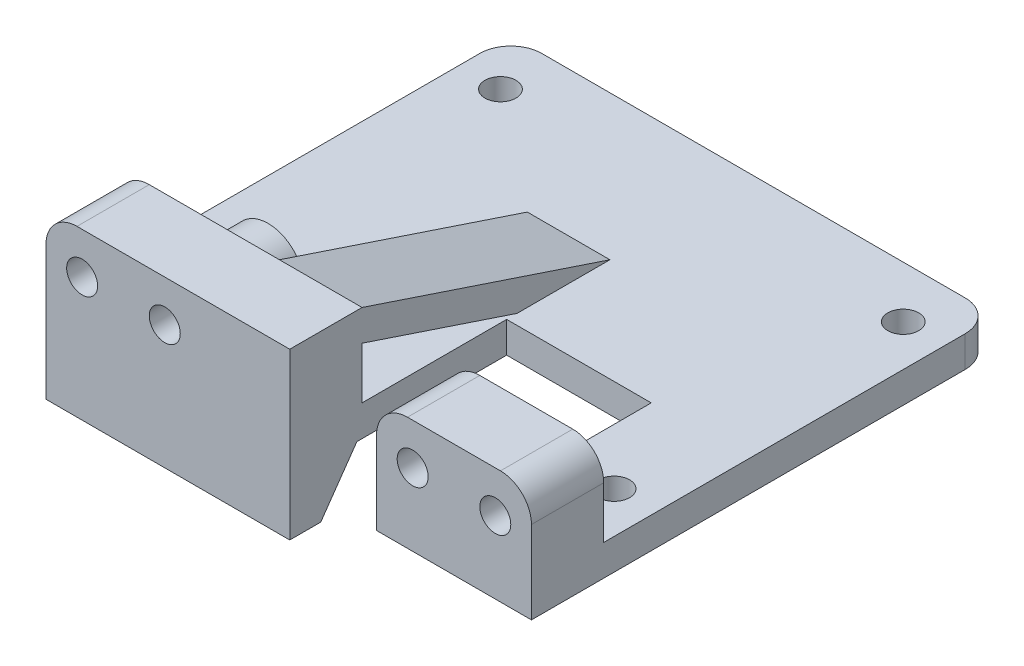
ISO-10303-21;
HEADER;
FILE_DESCRIPTION(('STEP AP214'),'2;1');
FILE_NAME('part.step','',(''),(''),'','','');
FILE_SCHEMA(('AUTOMOTIVE_DESIGN { 1 0 10303 214 1 1 1 1 }'));
ENDSEC;
DATA;
#1=APPLICATION_CONTEXT('core data for automotive mechanical design processes');
#2=APPLICATION_PROTOCOL_DEFINITION('international standard','automotive_design',2000,#1);
#3=PRODUCT_CONTEXT('',#1,'mechanical');
#4=PRODUCT('Part','Part','',(#3));
#5=PRODUCT_RELATED_PRODUCT_CATEGORY('part','',(#4));
#6=PRODUCT_DEFINITION_FORMATION('','',#4);
#7=PRODUCT_DEFINITION_CONTEXT('part definition',#1,'design');
#8=PRODUCT_DEFINITION('design','',#6,#7);
#9=PRODUCT_DEFINITION_SHAPE('','',#8);
#10=(LENGTH_UNIT() NAMED_UNIT(*) SI_UNIT(.MILLI.,.METRE.));
#11=(NAMED_UNIT(*) PLANE_ANGLE_UNIT() SI_UNIT($,.RADIAN.));
#12=(NAMED_UNIT(*) SI_UNIT($,.STERADIAN.) SOLID_ANGLE_UNIT());
#13=UNCERTAINTY_MEASURE_WITH_UNIT(LENGTH_MEASURE(1.E-05),#10,'distance_accuracy_value','');
#14=(GEOMETRIC_REPRESENTATION_CONTEXT(3) GLOBAL_UNCERTAINTY_ASSIGNED_CONTEXT((#13)) GLOBAL_UNIT_ASSIGNED_CONTEXT((#10,
#11,#12)) REPRESENTATION_CONTEXT('',''));
#15=CARTESIAN_POINT('',(0.,0.,0.));
#16=DIRECTION('',(0.,0.,1.));
#17=DIRECTION('',(1.,0.,0.));
#18=AXIS2_PLACEMENT_3D('',#15,#16,#17);
#19=CARTESIAN_POINT('',(0.,0.,19.));
#20=DIRECTION('',(0.,0.,1.));
#21=DIRECTION('',(1.,0.,0.));
#22=AXIS2_PLACEMENT_3D('',#19,#20,#21);
#23=PLANE('',#22);
#24=CARTESIAN_POINT('',(-20.,7.,19.));
#25=DIRECTION('',(0.,0.,1.));
#26=DIRECTION('',(1.,0.,0.));
#27=AXIS2_PLACEMENT_3D('',#24,#25,#26);
#28=CIRCLE('',#27,1.5);
#29=CARTESIAN_POINT('',(-18.5,7.,19.));
#30=VERTEX_POINT('',#29);
#31=EDGE_CURVE('E320',#30,#30,#28,.F.);
#32=ORIENTED_EDGE('',*,*,#31,.F.);
#33=EDGE_LOOP('',(#32));
#34=FACE_BOUND('',#33,.T.);
#35=DIRECTION('',(0.,1.,0.));
#36=VECTOR('',#35,1.);
#37=CARTESIAN_POINT('',(-23.5,0.,19.));
#38=LINE('',#37,#36);
#39=CARTESIAN_POINT('',(-23.5,3.,19.));
#40=VERTEX_POINT('',#39);
#41=CARTESIAN_POINT('',(-23.5,8.00000000000071,19.));
#42=VERTEX_POINT('',#41);
#43=EDGE_CURVE('E316',#40,#42,#38,.T.);
#44=ORIENTED_EDGE('',*,*,#43,.T.);
#45=CARTESIAN_POINT('',(-20.5,8.00000000000071,19.));
#46=DIRECTION('',(0.,0.,1.));
#47=DIRECTION('',(1.,0.,0.));
#48=AXIS2_PLACEMENT_3D('',#45,#46,#47);
#49=CIRCLE('',#48,3.);
#50=CARTESIAN_POINT('',(-20.4999999999999,11.0000000000007,19.));
#51=VERTEX_POINT('',#50);
#52=EDGE_CURVE('E411',#42,#51,#49,.F.);
#53=ORIENTED_EDGE('',*,*,#52,.T.);
#54=DIRECTION('',(-1.,0.,0.));
#55=VECTOR('',#54,1.);
#56=CARTESIAN_POINT('',(3.81639164714916E-13,11.,19.));
#57=LINE('',#56,#55);
#58=CARTESIAN_POINT('',(-7.9,11.,19.));
#59=VERTEX_POINT('',#58);
#60=EDGE_CURVE('E337',#59,#51,#57,.T.);
#61=ORIENTED_EDGE('',*,*,#60,.F.);
#62=DIRECTION('',(0.,-1.,0.));
#63=VECTOR('',#62,1.);
#64=CARTESIAN_POINT('',(-7.9,11.,19.));
#65=LINE('',#64,#63);
#66=CARTESIAN_POINT('',(-7.9,8.,19.));
#67=VERTEX_POINT('',#66);
#68=EDGE_CURVE('E257',#59,#67,#65,.T.);
#69=ORIENTED_EDGE('',*,*,#68,.T.);
#70=DIRECTION('',(1.,0.,0.));
#71=VECTOR('',#70,1.);
#72=CARTESIAN_POINT('',(-7.9,8.,19.));
#73=LINE('',#72,#71);
#74=CARTESIAN_POINT('',(0.0999999999999994,8.,19.));
#75=VERTEX_POINT('',#74);
#76=EDGE_CURVE('E266',#67,#75,#73,.T.);
#77=ORIENTED_EDGE('',*,*,#76,.T.);
#78=DIRECTION('',(0.,1.,0.));
#79=VECTOR('',#78,1.);
#80=CARTESIAN_POINT('',(0.0999999999999994,0.,19.));
#81=LINE('',#80,#79);
#82=CARTESIAN_POINT('',(0.0999999999999994,3.,19.));
#83=VERTEX_POINT('',#82);
#84=EDGE_CURVE('E334',#83,#75,#81,.T.);
#85=ORIENTED_EDGE('',*,*,#84,.F.);
#86=DIRECTION('',(1.,0.,0.));
#87=VECTOR('',#86,1.);
#88=CARTESIAN_POINT('',(0.,3.,19.));
#89=LINE('',#88,#87);
#90=EDGE_CURVE('E363',#40,#83,#89,.T.);
#91=ORIENTED_EDGE('',*,*,#90,.F.);
#92=EDGE_LOOP('',(#44,#53,#61,#69,#77,#85,#91));
#93=FACE_BOUND('',#92,.T.);
#94=CARTESIAN_POINT('',(-12.,7.,19.));
#95=DIRECTION('',(0.,0.,1.));
#96=DIRECTION('',(1.,0.,0.));
#97=AXIS2_PLACEMENT_3D('',#94,#95,#96);
#98=CIRCLE('',#97,3.5);
#99=CARTESIAN_POINT('',(-8.50000000000001,7.,19.));
#100=VERTEX_POINT('',#99);
#101=EDGE_CURVE('E11',#100,#100,#98,.F.);
#102=ORIENTED_EDGE('',*,*,#101,.F.);
#103=EDGE_LOOP('',(#102));
#104=FACE_BOUND('',#103,.T.);
#105=ADVANCED_FACE('F49',(#34,#93,#104),#23,.F.);
#106=CARTESIAN_POINT('',(0.,3.,5.));
#107=DIRECTION('',(0.,0.,-1.));
#108=DIRECTION('',(-1.,0.,0.));
#109=AXIS2_PLACEMENT_3D('',#106,#107,#108);
#110=PLANE('',#109);
#111=DIRECTION('',(1.,0.,0.));
#112=VECTOR('',#111,1.);
#113=CARTESIAN_POINT('',(0.,0.,5.));
#114=LINE('',#113,#112);
#115=CARTESIAN_POINT('',(0.0999999999999994,0.,5.));
#116=VERTEX_POINT('',#115);
#117=CARTESIAN_POINT('',(14.1,0.,5.));
#118=VERTEX_POINT('',#117);
#119=EDGE_CURVE('E384',#116,#118,#114,.T.);
#120=ORIENTED_EDGE('',*,*,#119,.T.);
#121=DIRECTION('',(0.,-1.,0.));
#122=VECTOR('',#121,1.);
#123=CARTESIAN_POINT('',(14.1,3.,5.));
#124=LINE('',#123,#122);
#125=CARTESIAN_POINT('',(14.1,3.,5.));
#126=VERTEX_POINT('',#125);
#127=EDGE_CURVE('E405',#126,#118,#124,.T.);
#128=ORIENTED_EDGE('',*,*,#127,.F.);
#129=DIRECTION('',(1.,0.,0.));
#130=VECTOR('',#129,1.);
#131=CARTESIAN_POINT('',(0.,3.,5.));
#132=LINE('',#131,#130);
#133=CARTESIAN_POINT('',(0.0999999999999994,3.,5.));
#134=VERTEX_POINT('',#133);
#135=EDGE_CURVE('E353',#134,#126,#132,.T.);
#136=ORIENTED_EDGE('',*,*,#135,.F.);
#137=DIRECTION('',(0.,-1.,0.));
#138=VECTOR('',#137,1.);
#139=CARTESIAN_POINT('',(0.0999999999999994,3.,5.));
#140=LINE('',#139,#138);
#141=EDGE_CURVE('E378',#134,#116,#140,.T.);
#142=ORIENTED_EDGE('',*,*,#141,.T.);
#143=EDGE_LOOP('',(#120,#128,#136,#142));
#144=FACE_BOUND('',#143,.T.);
#145=ADVANCED_FACE('F472',(#144),#110,.F.);
#146=CARTESIAN_POINT('',(14.1,3.,0.));
#147=DIRECTION('',(1.,0.,0.));
#148=DIRECTION('',(0.,0.,-1.));
#149=AXIS2_PLACEMENT_3D('',#146,#147,#148);
#150=PLANE('',#149);
#151=DIRECTION('',(0.,0.,1.));
#152=VECTOR('',#151,1.);
#153=CARTESIAN_POINT('',(14.1,0.,0.));
#154=LINE('',#153,#152);
#155=CARTESIAN_POINT('',(14.1,0.,14.));
#156=VERTEX_POINT('',#155);
#157=EDGE_CURVE('E387',#118,#156,#154,.T.);
#158=ORIENTED_EDGE('',*,*,#157,.T.);
#159=DIRECTION('',(0.,-1.,0.));
#160=VECTOR('',#159,1.);
#161=CARTESIAN_POINT('',(14.1,3.,14.));
#162=LINE('',#161,#160);
#163=CARTESIAN_POINT('',(14.1,3.,14.));
#164=VERTEX_POINT('',#163);
#165=EDGE_CURVE('E438',#156,#164,#162,.F.);
#166=ORIENTED_EDGE('',*,*,#165,.T.);
#167=DIRECTION('',(0.,0.,1.));
#168=VECTOR('',#167,1.);
#169=CARTESIAN_POINT('',(14.1,3.,0.));
#170=LINE('',#169,#168);
#171=EDGE_CURVE('E356',#126,#164,#170,.T.);
#172=ORIENTED_EDGE('',*,*,#171,.F.);
#173=ORIENTED_EDGE('',*,*,#127,.T.);
#174=EDGE_LOOP('',(#158,#166,#172,#173));
#175=FACE_BOUND('',#174,.T.);
#176=ADVANCED_FACE('F530',(#175),#150,.F.);
#177=CARTESIAN_POINT('',(23.5,3.,0.));
#178=DIRECTION('',(-1.,0.,0.));
#179=DIRECTION('',(0.,0.,1.));
#180=AXIS2_PLACEMENT_3D('',#177,#178,#179);
#181=PLANE('',#180);
#182=DIRECTION('',(0.,0.,-1.));
#183=VECTOR('',#182,1.);
#184=CARTESIAN_POINT('',(23.5,0.,0.));
#185=LINE('',#184,#183);
#186=CARTESIAN_POINT('',(23.5,0.,26.));
#187=VERTEX_POINT('',#186);
#188=CARTESIAN_POINT('',(23.5,0.,-16.));
#189=VERTEX_POINT('',#188);
#190=EDGE_CURVE('E390',#187,#189,#185,.T.);
#191=ORIENTED_EDGE('',*,*,#190,.T.);
#192=DIRECTION('',(0.,-1.,0.));
#193=VECTOR('',#192,1.);
#194=CARTESIAN_POINT('',(23.5,3.,-16.));
#195=LINE('',#194,#193);
#196=CARTESIAN_POINT('',(23.5,3.,-16.));
#197=VERTEX_POINT('',#196);
#198=EDGE_CURVE('E72',#189,#197,#195,.F.);
#199=ORIENTED_EDGE('',*,*,#198,.T.);
#200=DIRECTION('',(0.,0.,-1.));
#201=VECTOR('',#200,1.);
#202=CARTESIAN_POINT('',(23.5,3.,0.));
#203=LINE('',#202,#201);
#204=CARTESIAN_POINT('',(23.5,3.,19.));
#205=VERTEX_POINT('',#204);
#206=EDGE_CURVE('E362',#205,#197,#203,.T.);
#207=ORIENTED_EDGE('',*,*,#206,.F.);
#208=DIRECTION('',(0.,-1.,0.));
#209=VECTOR('',#208,1.);
#210=CARTESIAN_POINT('',(23.5,0.,19.));
#211=LINE('',#210,#209);
#212=CARTESIAN_POINT('',(23.5,8.,19.));
#213=VERTEX_POINT('',#212);
#214=EDGE_CURVE('E285',#213,#205,#211,.T.);
#215=ORIENTED_EDGE('',*,*,#214,.F.);
#216=DIRECTION('',(0.,0.,-1.));
#217=VECTOR('',#216,1.);
#218=CARTESIAN_POINT('',(23.5,8.,26.));
#219=LINE('',#218,#217);
#220=CARTESIAN_POINT('',(23.5,8.,26.));
#221=VERTEX_POINT('',#220);
#222=EDGE_CURVE('E433',#213,#221,#219,.F.);
#223=ORIENTED_EDGE('',*,*,#222,.T.);
#224=DIRECTION('',(0.,-1.,0.));
#225=VECTOR('',#224,1.);
#226=CARTESIAN_POINT('',(23.5,0.,26.));
#227=LINE('',#226,#225);
#228=EDGE_CURVE('E297',#221,#187,#227,.T.);
#229=ORIENTED_EDGE('',*,*,#228,.T.);
#230=EDGE_LOOP('',(#191,#199,#207,#215,#223,#229));
#231=FACE_BOUND('',#230,.T.);
#232=ADVANCED_FACE('F567',(#231),#181,.F.);
#233=CARTESIAN_POINT('',(0.,3.,-19.));
#234=DIRECTION('',(0.,0.,-1.));
#235=DIRECTION('',(-1.,0.,0.));
#236=AXIS2_PLACEMENT_3D('',#233,#234,#235);
#237=PLANE('',#236);
#238=DIRECTION('',(1.,0.,0.));
#239=VECTOR('',#238,1.);
#240=CARTESIAN_POINT('',(0.,3.,-19.));
#241=LINE('',#240,#239);
#242=CARTESIAN_POINT('',(-20.5,3.,-19.));
#243=VERTEX_POINT('',#242);
#244=CARTESIAN_POINT('',(20.5,3.,-19.));
#245=VERTEX_POINT('',#244);
#246=EDGE_CURVE('E365',#243,#245,#241,.T.);
#247=ORIENTED_EDGE('',*,*,#246,.T.);
#248=DIRECTION('',(0.,-1.,0.));
#249=VECTOR('',#248,1.);
#250=CARTESIAN_POINT('',(20.5,0.,-19.));
#251=LINE('',#250,#249);
#252=CARTESIAN_POINT('',(20.5,0.,-19.));
#253=VERTEX_POINT('',#252);
#254=EDGE_CURVE('E447',#245,#253,#251,.T.);
#255=ORIENTED_EDGE('',*,*,#254,.T.);
#256=DIRECTION('',(1.,0.,0.));
#257=VECTOR('',#256,1.);
#258=CARTESIAN_POINT('',(0.,0.,-19.));
#259=LINE('',#258,#257);
#260=CARTESIAN_POINT('',(-20.5,0.,-19.));
#261=VERTEX_POINT('',#260);
#262=EDGE_CURVE('E392',#261,#253,#259,.T.);
#263=ORIENTED_EDGE('',*,*,#262,.F.);
#264=DIRECTION('',(0.,-1.,0.));
#265=VECTOR('',#264,1.);
#266=CARTESIAN_POINT('',(-20.5,3.,-19.));
#267=LINE('',#266,#265);
#268=EDGE_CURVE('E445',#261,#243,#267,.F.);
#269=ORIENTED_EDGE('',*,*,#268,.T.);
#270=EDGE_LOOP('',(#247,#255,#263,#269));
#271=FACE_BOUND('',#270,.T.);
#272=ADVANCED_FACE('F564',(#271),#237,.T.);
#273=CARTESIAN_POINT('',(-23.5,3.,0.));
#274=DIRECTION('',(-1.,0.,0.));
#275=DIRECTION('',(0.,0.,1.));
#276=AXIS2_PLACEMENT_3D('',#273,#274,#275);
#277=PLANE('',#276);
#278=DIRECTION('',(0.,0.,-1.));
#279=VECTOR('',#278,1.);
#280=CARTESIAN_POINT('',(-23.5,3.,0.));
#281=LINE('',#280,#279);
#282=CARTESIAN_POINT('',(-23.5,3.,-16.));
#283=VERTEX_POINT('',#282);
#284=EDGE_CURVE('E368',#40,#283,#281,.T.);
#285=ORIENTED_EDGE('',*,*,#284,.T.);
#286=DIRECTION('',(0.,-1.,0.));
#287=VECTOR('',#286,1.);
#288=CARTESIAN_POINT('',(-23.5,3.,-16.));
#289=LINE('',#288,#287);
#290=CARTESIAN_POINT('',(-23.5,0.,-16.));
#291=VERTEX_POINT('',#290);
#292=EDGE_CURVE('E57',#283,#291,#289,.T.);
#293=ORIENTED_EDGE('',*,*,#292,.T.);
#294=DIRECTION('',(0.,0.,-1.));
#295=VECTOR('',#294,1.);
#296=CARTESIAN_POINT('',(-23.5,0.,0.));
#297=LINE('',#296,#295);
#298=CARTESIAN_POINT('',(-23.5,0.,19.5));
#299=VERTEX_POINT('',#298);
#300=EDGE_CURVE('E241',#299,#291,#297,.T.);
#301=ORIENTED_EDGE('',*,*,#300,.F.);
#302=DIRECTION('',(0.,-0.81923192051904,0.573462344363328));
#303=VECTOR('',#302,1.);
#304=CARTESIAN_POINT('',(-23.5,-5.,23.));
#305=LINE('',#304,#303);
#306=CARTESIAN_POINT('',(-23.5,-5.,23.));
#307=VERTEX_POINT('',#306);
#308=EDGE_CURVE('E221',#299,#307,#305,.T.);
#309=ORIENTED_EDGE('',*,*,#308,.T.);
#310=DIRECTION('',(0.,0.,1.));
#311=VECTOR('',#310,1.);
#312=CARTESIAN_POINT('',(-23.5,-5.,26.));
#313=LINE('',#312,#311);
#314=CARTESIAN_POINT('',(-23.5,-5.,26.));
#315=VERTEX_POINT('',#314);
#316=EDGE_CURVE('E231',#307,#315,#313,.T.);
#317=ORIENTED_EDGE('',*,*,#316,.T.);
#318=DIRECTION('',(0.,1.,0.));
#319=VECTOR('',#318,1.);
#320=CARTESIAN_POINT('',(-23.5,0.,26.));
#321=LINE('',#320,#319);
#322=CARTESIAN_POINT('',(-23.5,8.00000000000071,26.));
#323=VERTEX_POINT('',#322);
#324=EDGE_CURVE('E317',#315,#323,#321,.T.);
#325=ORIENTED_EDGE('',*,*,#324,.T.);
#326=DIRECTION('',(0.,0.,-1.));
#327=VECTOR('',#326,1.);
#328=CARTESIAN_POINT('',(-23.5,8.00000000000071,19.));
#329=LINE('',#328,#327);
#330=EDGE_CURVE('E408',#323,#42,#329,.T.);
#331=ORIENTED_EDGE('',*,*,#330,.T.);
#332=ORIENTED_EDGE('',*,*,#43,.F.);
#333=EDGE_LOOP('',(#285,#293,#301,#309,#317,#325,#331,#332));
#334=FACE_BOUND('',#333,.T.);
#335=ADVANCED_FACE('F238',(#334),#277,.T.);
#336=CARTESIAN_POINT('',(-19.5,3.,14.));
#337=DIRECTION('',(0.,-1.,0.));
#338=DIRECTION('',(0.,0.,-1.));
#339=AXIS2_PLACEMENT_3D('',#336,#337,#338);
#340=CYLINDRICAL_SURFACE('',#339,1.5);
#341=CARTESIAN_POINT('',(-19.5,3.,14.));
#342=DIRECTION('',(0.,1.,0.));
#343=DIRECTION('',(0.,0.,1.));
#344=AXIS2_PLACEMENT_3D('',#341,#342,#343);
#345=CIRCLE('',#344,1.5);
#346=CARTESIAN_POINT('',(-19.5,3.,15.5));
#347=VERTEX_POINT('',#346);
#348=EDGE_CURVE('E372',#347,#347,#345,.T.);
#349=ORIENTED_EDGE('',*,*,#348,.T.);
#350=EDGE_LOOP('',(#349));
#351=FACE_BOUND('',#350,.T.);
#352=CARTESIAN_POINT('',(-19.5,0.,14.));
#353=DIRECTION('',(0.,1.,0.));
#354=DIRECTION('',(0.,0.,1.));
#355=AXIS2_PLACEMENT_3D('',#352,#353,#354);
#356=CIRCLE('',#355,1.5);
#357=CARTESIAN_POINT('',(-19.5,0.,15.5));
#358=VERTEX_POINT('',#357);
#359=EDGE_CURVE('E398',#358,#358,#356,.T.);
#360=ORIENTED_EDGE('',*,*,#359,.F.);
#361=EDGE_LOOP('',(#360));
#362=FACE_BOUND('',#361,.T.);
#363=ADVANCED_FACE('F555',(#351,#362),#340,.F.);
#364=CARTESIAN_POINT('',(0.0999999999999994,3.,0.));
#365=DIRECTION('',(-1.,0.,0.));
#366=DIRECTION('',(0.,0.,1.));
#367=AXIS2_PLACEMENT_3D('',#364,#365,#366);
#368=PLANE('',#367);
#369=DIRECTION('',(0.,1.,0.));
#370=VECTOR('',#369,1.);
#371=CARTESIAN_POINT('',(0.0999999999999994,0.,26.));
#372=LINE('',#371,#370);
#373=CARTESIAN_POINT('',(0.0999999999999994,-5.,26.));
#374=VERTEX_POINT('',#373);
#375=CARTESIAN_POINT('',(0.0999999999999995,11.,26.));
#376=VERTEX_POINT('',#375);
#377=EDGE_CURVE('E319',#374,#376,#372,.T.);
#378=ORIENTED_EDGE('',*,*,#377,.F.);
#379=DIRECTION('',(0.,0.,-1.));
#380=VECTOR('',#379,1.);
#381=CARTESIAN_POINT('',(0.0999999999999994,-5.,26.));
#382=LINE('',#381,#380);
#383=CARTESIAN_POINT('',(0.0999999999999994,-5.,23.));
#384=VERTEX_POINT('',#383);
#385=EDGE_CURVE('E248',#374,#384,#382,.T.);
#386=ORIENTED_EDGE('',*,*,#385,.T.);
#387=DIRECTION('',(0.,0.81923192051904,-0.573462344363328));
#388=VECTOR('',#387,1.);
#389=CARTESIAN_POINT('',(0.0999999999999994,-5.,23.));
#390=LINE('',#389,#388);
#391=CARTESIAN_POINT('',(0.0999999999999994,0.,19.5));
#392=VERTEX_POINT('',#391);
#393=EDGE_CURVE('E223',#384,#392,#390,.T.);
#394=ORIENTED_EDGE('',*,*,#393,.T.);
#395=DIRECTION('',(0.,0.,-1.));
#396=VECTOR('',#395,1.);
#397=CARTESIAN_POINT('',(0.0999999999999994,0.,0.));
#398=LINE('',#397,#396);
#399=EDGE_CURVE('E396',#392,#116,#398,.T.);
#400=ORIENTED_EDGE('',*,*,#399,.T.);
#401=ORIENTED_EDGE('',*,*,#141,.F.);
#402=DIRECTION('',(0.,0.,-1.));
#403=VECTOR('',#402,1.);
#404=CARTESIAN_POINT('',(0.0999999999999994,3.,0.));
#405=LINE('',#404,#403);
#406=EDGE_CURVE('E370',#83,#134,#405,.T.);
#407=ORIENTED_EDGE('',*,*,#406,.F.);
#408=ORIENTED_EDGE('',*,*,#84,.T.);
#409=DIRECTION('',(0.,-0.316227766016838,-0.948683298050514));
#410=VECTOR('',#409,1.);
#411=CARTESIAN_POINT('',(0.0999999999999994,3.,3.99999999999998));
#412=LINE('',#411,#410);
#413=CARTESIAN_POINT('',(0.0999999999999994,3.,3.99999999999998));
#414=VERTEX_POINT('',#413);
#415=EDGE_CURVE('E268',#75,#414,#412,.T.);
#416=ORIENTED_EDGE('',*,*,#415,.T.);
#417=DIRECTION('',(0.,0.,-1.));
#418=VECTOR('',#417,1.);
#419=CARTESIAN_POINT('',(0.0999999999999994,3.,-5.00000000000002));
#420=LINE('',#419,#418);
#421=CARTESIAN_POINT('',(0.0999999999999994,3.,-5.00000000000002));
#422=VERTEX_POINT('',#421);
#423=EDGE_CURVE('E258',#414,#422,#420,.T.);
#424=ORIENTED_EDGE('',*,*,#423,.T.);
#425=DIRECTION('',(0.,0.316227766016838,0.948683298050514));
#426=VECTOR('',#425,1.);
#427=CARTESIAN_POINT('',(0.0999999999999994,11.,19.));
#428=LINE('',#427,#426);
#429=CARTESIAN_POINT('',(0.0999999999999995,11.,19.));
#430=VERTEX_POINT('',#429);
#431=EDGE_CURVE('E253',#422,#430,#428,.T.);
#432=ORIENTED_EDGE('',*,*,#431,.T.);
#433=DIRECTION('',(0.,0.,-1.));
#434=VECTOR('',#433,1.);
#435=CARTESIAN_POINT('',(0.0999999999999995,11.,26.));
#436=LINE('',#435,#434);
#437=EDGE_CURVE('E331',#376,#430,#436,.T.);
#438=ORIENTED_EDGE('',*,*,#437,.F.);
#439=EDGE_LOOP('',(#378,#386,#394,#400,#401,#407,#408,#416,#424,#432,#438));
#440=FACE_BOUND('',#439,.T.);
#441=ADVANCED_FACE('F468',(#440),#368,.F.);
#442=CARTESIAN_POINT('',(19.5,3.,-14.));
#443=DIRECTION('',(0.,-1.,0.));
#444=DIRECTION('',(0.,0.,-1.));
#445=AXIS2_PLACEMENT_3D('',#442,#443,#444);
#446=CYLINDRICAL_SURFACE('',#445,1.5);
#447=CARTESIAN_POINT('',(19.5,3.,-14.));
#448=DIRECTION('',(0.,1.,0.));
#449=DIRECTION('',(0.,0.,1.));
#450=AXIS2_PLACEMENT_3D('',#447,#448,#449);
#451=CIRCLE('',#450,1.5);
#452=CARTESIAN_POINT('',(19.5,3.,-12.5));
#453=VERTEX_POINT('',#452);
#454=EDGE_CURVE('E349',#453,#453,#451,.T.);
#455=ORIENTED_EDGE('',*,*,#454,.T.);
#456=EDGE_LOOP('',(#455));
#457=FACE_BOUND('',#456,.T.);
#458=CARTESIAN_POINT('',(19.5,0.,-14.));
#459=DIRECTION('',(0.,1.,0.));
#460=DIRECTION('',(0.,0.,1.));
#461=AXIS2_PLACEMENT_3D('',#458,#459,#460);
#462=CIRCLE('',#461,1.5);
#463=CARTESIAN_POINT('',(19.5,0.,-12.5));
#464=VERTEX_POINT('',#463);
#465=EDGE_CURVE('E381',#464,#464,#462,.T.);
#466=ORIENTED_EDGE('',*,*,#465,.F.);
#467=EDGE_LOOP('',(#466));
#468=FACE_BOUND('',#467,.T.);
#469=ADVANCED_FACE('F561',(#457,#468),#446,.F.);
#470=CARTESIAN_POINT('',(19.5,3.,14.));
#471=DIRECTION('',(0.,-1.,0.));
#472=DIRECTION('',(0.,0.,-1.));
#473=AXIS2_PLACEMENT_3D('',#470,#471,#472);
#474=CYLINDRICAL_SURFACE('',#473,1.5);
#475=CARTESIAN_POINT('',(19.5,3.,14.));
#476=DIRECTION('',(0.,1.,0.));
#477=DIRECTION('',(0.,0.,1.));
#478=AXIS2_PLACEMENT_3D('',#475,#476,#477);
#479=CIRCLE('',#478,1.5);
#480=CARTESIAN_POINT('',(19.5,3.,15.5));
#481=VERTEX_POINT('',#480);
#482=EDGE_CURVE('E346',#481,#481,#479,.F.);
#483=ORIENTED_EDGE('',*,*,#482,.F.);
#484=EDGE_LOOP('',(#483));
#485=FACE_BOUND('',#484,.T.);
#486=CARTESIAN_POINT('',(19.5,0.,14.));
#487=DIRECTION('',(0.,1.,0.));
#488=DIRECTION('',(0.,0.,1.));
#489=AXIS2_PLACEMENT_3D('',#486,#487,#488);
#490=CIRCLE('',#489,1.5);
#491=CARTESIAN_POINT('',(19.5,0.,15.5));
#492=VERTEX_POINT('',#491);
#493=EDGE_CURVE('E345',#492,#492,#490,.F.);
#494=ORIENTED_EDGE('',*,*,#493,.T.);
#495=EDGE_LOOP('',(#494));
#496=FACE_BOUND('',#495,.T.);
#497=ADVANCED_FACE('F553',(#485,#496),#474,.F.);
#498=CARTESIAN_POINT('',(-19.5,3.,-14.));
#499=DIRECTION('',(0.,-1.,0.));
#500=DIRECTION('',(0.,0.,-1.));
#501=AXIS2_PLACEMENT_3D('',#498,#499,#500);
#502=CYLINDRICAL_SURFACE('',#501,1.5);
#503=CARTESIAN_POINT('',(-19.5,3.,-14.));
#504=DIRECTION('',(0.,1.,0.));
#505=DIRECTION('',(0.,0.,1.));
#506=AXIS2_PLACEMENT_3D('',#503,#504,#505);
#507=CIRCLE('',#506,1.5);
#508=CARTESIAN_POINT('',(-19.5,3.,-12.5));
#509=VERTEX_POINT('',#508);
#510=EDGE_CURVE('E375',#509,#509,#507,.F.);
#511=ORIENTED_EDGE('',*,*,#510,.F.);
#512=EDGE_LOOP('',(#511));
#513=FACE_BOUND('',#512,.T.);
#514=CARTESIAN_POINT('',(-19.5,0.,-14.));
#515=DIRECTION('',(0.,1.,0.));
#516=DIRECTION('',(0.,0.,1.));
#517=AXIS2_PLACEMENT_3D('',#514,#515,#516);
#518=CIRCLE('',#517,1.5);
#519=CARTESIAN_POINT('',(-19.5,0.,-12.5));
#520=VERTEX_POINT('',#519);
#521=EDGE_CURVE('E350',#520,#520,#518,.F.);
#522=ORIENTED_EDGE('',*,*,#521,.T.);
#523=EDGE_LOOP('',(#522));
#524=FACE_BOUND('',#523,.T.);
#525=ADVANCED_FACE('F547',(#513,#524),#502,.F.);
#526=CARTESIAN_POINT('',(0.,3.,0.));
#527=DIRECTION('',(0.,1.,0.));
#528=DIRECTION('',(0.,0.,1.));
#529=AXIS2_PLACEMENT_3D('',#526,#527,#528);
#530=PLANE('',#529);
#531=DIRECTION('',(0.,0.,-1.));
#532=VECTOR('',#531,1.);
#533=CARTESIAN_POINT('',(-7.9,3.,-5.00000000000002));
#534=LINE('',#533,#532);
#535=CARTESIAN_POINT('',(-7.9,3.,3.99999999999998));
#536=VERTEX_POINT('',#535);
#537=CARTESIAN_POINT('',(-7.9,3.,-5.00000000000002));
#538=VERTEX_POINT('',#537);
#539=EDGE_CURVE('E263',#536,#538,#534,.T.);
#540=ORIENTED_EDGE('',*,*,#539,.T.);
#541=DIRECTION('',(1.,0.,0.));
#542=VECTOR('',#541,1.);
#543=CARTESIAN_POINT('',(-7.9,3.,-5.00000000000002));
#544=LINE('',#543,#542);
#545=EDGE_CURVE('E272',#538,#422,#544,.T.);
#546=ORIENTED_EDGE('',*,*,#545,.T.);
#547=ORIENTED_EDGE('',*,*,#423,.F.);
#548=DIRECTION('',(1.,0.,0.));
#549=VECTOR('',#548,1.);
#550=CARTESIAN_POINT('',(-7.9,3.,3.99999999999998));
#551=LINE('',#550,#549);
#552=EDGE_CURVE('E276',#536,#414,#551,.T.);
#553=ORIENTED_EDGE('',*,*,#552,.F.);
#554=EDGE_LOOP('',(#540,#546,#547,#553));
#555=FACE_BOUND('',#554,.T.);
#556=ORIENTED_EDGE('',*,*,#482,.T.);
#557=EDGE_LOOP('',(#556));
#558=FACE_BOUND('',#557,.T.);
#559=ORIENTED_EDGE('',*,*,#454,.F.);
#560=EDGE_LOOP('',(#559));
#561=FACE_BOUND('',#560,.T.);
#562=ORIENTED_EDGE('',*,*,#206,.T.);
#563=CARTESIAN_POINT('',(20.5,3.,-16.));
#564=DIRECTION('',(0.,1.,0.));
#565=DIRECTION('',(0.,0.,1.));
#566=AXIS2_PLACEMENT_3D('',#563,#564,#565);
#567=CIRCLE('',#566,3.);
#568=EDGE_CURVE('E456',#197,#245,#567,.T.);
#569=ORIENTED_EDGE('',*,*,#568,.T.);
#570=ORIENTED_EDGE('',*,*,#246,.F.);
#571=CARTESIAN_POINT('',(-20.5,3.,-16.));
#572=DIRECTION('',(0.,1.,0.));
#573=DIRECTION('',(0.,0.,1.));
#574=AXIS2_PLACEMENT_3D('',#571,#572,#573);
#575=CIRCLE('',#574,3.);
#576=EDGE_CURVE('E64',#243,#283,#575,.T.);
#577=ORIENTED_EDGE('',*,*,#576,.T.);
#578=ORIENTED_EDGE('',*,*,#284,.F.);
#579=ORIENTED_EDGE('',*,*,#90,.T.);
#580=ORIENTED_EDGE('',*,*,#406,.T.);
#581=ORIENTED_EDGE('',*,*,#135,.T.);
#582=ORIENTED_EDGE('',*,*,#171,.T.);
#583=CARTESIAN_POINT('',(9.1,3.,14.));
#584=DIRECTION('',(0.,1.,0.));
#585=DIRECTION('',(0.,0.,1.));
#586=AXIS2_PLACEMENT_3D('',#583,#584,#585);
#587=CIRCLE('',#586,5.);
#588=CARTESIAN_POINT('',(9.1,3.,19.));
#589=VERTEX_POINT('',#588);
#590=EDGE_CURVE('E442',#164,#589,#587,.F.);
#591=ORIENTED_EDGE('',*,*,#590,.T.);
#592=EDGE_CURVE('E359',#589,#205,#89,.T.);
#593=ORIENTED_EDGE('',*,*,#592,.T.);
#594=EDGE_LOOP('',(#562,#569,#570,#577,#578,#579,#580,#581,#582,#591,#593));
#595=FACE_BOUND('',#594,.T.);
#596=ORIENTED_EDGE('',*,*,#348,.F.);
#597=EDGE_LOOP('',(#596));
#598=FACE_BOUND('',#597,.T.);
#599=ORIENTED_EDGE('',*,*,#510,.T.);
#600=EDGE_LOOP('',(#599));
#601=FACE_BOUND('',#600,.T.);
#602=ADVANCED_FACE('F474',(#555,#558,#561,#595,#598,#601),#530,.T.);
#603=CARTESIAN_POINT('',(0.,0.,0.));
#604=DIRECTION('',(0.,1.,0.));
#605=DIRECTION('',(0.,0.,1.));
#606=AXIS2_PLACEMENT_3D('',#603,#604,#605);
#607=PLANE('',#606);
#608=ORIENTED_EDGE('',*,*,#493,.F.);
#609=EDGE_LOOP('',(#608));
#610=FACE_BOUND('',#609,.T.);
#611=ORIENTED_EDGE('',*,*,#465,.T.);
#612=EDGE_LOOP('',(#611));
#613=FACE_BOUND('',#612,.T.);
#614=ORIENTED_EDGE('',*,*,#262,.T.);
#615=CARTESIAN_POINT('',(20.5,0.,-16.));
#616=DIRECTION('',(0.,1.,0.));
#617=DIRECTION('',(0.,0.,1.));
#618=AXIS2_PLACEMENT_3D('',#615,#616,#617);
#619=CIRCLE('',#618,3.);
#620=EDGE_CURVE('E452',#253,#189,#619,.F.);
#621=ORIENTED_EDGE('',*,*,#620,.T.);
#622=ORIENTED_EDGE('',*,*,#190,.F.);
#623=DIRECTION('',(-1.,0.,0.));
#624=VECTOR('',#623,1.);
#625=CARTESIAN_POINT('',(0.,0.,26.));
#626=LINE('',#625,#624);
#627=CARTESIAN_POINT('',(8.50000000000001,0.,26.));
#628=VERTEX_POINT('',#627);
#629=EDGE_CURVE('E294',#187,#628,#626,.T.);
#630=ORIENTED_EDGE('',*,*,#629,.T.);
#631=DIRECTION('',(0.,0.,-1.));
#632=VECTOR('',#631,1.);
#633=CARTESIAN_POINT('',(8.50000000000001,0.,26.));
#634=LINE('',#633,#632);
#635=CARTESIAN_POINT('',(8.50000000000001,0.,19.));
#636=VERTEX_POINT('',#635);
#637=EDGE_CURVE('E299',#628,#636,#634,.T.);
#638=ORIENTED_EDGE('',*,*,#637,.T.);
#639=DIRECTION('',(-1.,0.,0.));
#640=VECTOR('',#639,1.);
#641=CARTESIAN_POINT('',(0.,0.,19.));
#642=LINE('',#641,#640);
#643=CARTESIAN_POINT('',(9.1,0.,19.));
#644=VERTEX_POINT('',#643);
#645=EDGE_CURVE('E311',#644,#636,#642,.T.);
#646=ORIENTED_EDGE('',*,*,#645,.F.);
#647=CARTESIAN_POINT('',(9.1,0.,14.));
#648=DIRECTION('',(0.,1.,0.));
#649=DIRECTION('',(0.,0.,1.));
#650=AXIS2_PLACEMENT_3D('',#647,#648,#649);
#651=CIRCLE('',#650,5.);
#652=EDGE_CURVE('E440',#644,#156,#651,.T.);
#653=ORIENTED_EDGE('',*,*,#652,.T.);
#654=ORIENTED_EDGE('',*,*,#157,.F.);
#655=ORIENTED_EDGE('',*,*,#119,.F.);
#656=ORIENTED_EDGE('',*,*,#399,.F.);
#657=DIRECTION('',(-1.,0.,0.));
#658=VECTOR('',#657,1.);
#659=CARTESIAN_POINT('',(8.30060973342836,0.,19.5));
#660=LINE('',#659,#658);
#661=EDGE_CURVE('E227',#392,#299,#660,.T.);
#662=ORIENTED_EDGE('',*,*,#661,.T.);
#663=ORIENTED_EDGE('',*,*,#300,.T.);
#664=CARTESIAN_POINT('',(-20.5,0.,-16.));
#665=DIRECTION('',(0.,1.,0.));
#666=DIRECTION('',(0.,0.,1.));
#667=AXIS2_PLACEMENT_3D('',#664,#665,#666);
#668=CIRCLE('',#667,3.);
#669=EDGE_CURVE('E450',#291,#261,#668,.F.);
#670=ORIENTED_EDGE('',*,*,#669,.T.);
#671=EDGE_LOOP('',(#614,#621,#622,#630,#638,#646,#653,#654,#655,#656,#662,#663,#670));
#672=FACE_BOUND('',#671,.T.);
#673=ORIENTED_EDGE('',*,*,#359,.T.);
#674=EDGE_LOOP('',(#673));
#675=FACE_BOUND('',#674,.T.);
#676=ORIENTED_EDGE('',*,*,#521,.F.);
#677=EDGE_LOOP('',(#676));
#678=FACE_BOUND('',#677,.T.);
#679=ADVANCED_FACE('F461',(#610,#613,#672,#675,#678),#607,.F.);
#680=CARTESIAN_POINT('',(-20.,7.,26.));
#681=DIRECTION('',(0.,0.,-1.));
#682=DIRECTION('',(-1.,0.,0.));
#683=AXIS2_PLACEMENT_3D('',#680,#681,#682);
#684=CYLINDRICAL_SURFACE('',#683,1.5);
#685=CARTESIAN_POINT('',(-20.,7.,26.));
#686=DIRECTION('',(0.,0.,1.));
#687=DIRECTION('',(1.,0.,0.));
#688=AXIS2_PLACEMENT_3D('',#685,#686,#687);
#689=CIRCLE('',#688,1.5);
#690=CARTESIAN_POINT('',(-18.5,7.,26.));
#691=VERTEX_POINT('',#690);
#692=EDGE_CURVE('E325',#691,#691,#689,.F.);
#693=ORIENTED_EDGE('',*,*,#692,.F.);
#694=EDGE_LOOP('',(#693));
#695=FACE_BOUND('',#694,.T.);
#696=ORIENTED_EDGE('',*,*,#31,.T.);
#697=EDGE_LOOP('',(#696));
#698=FACE_BOUND('',#697,.T.);
#699=ADVANCED_FACE('F539',(#695,#698),#684,.F.);
#700=CARTESIAN_POINT('',(3.81639164714916E-13,11.,26.));
#701=DIRECTION('',(0.,-1.,0.));
#702=DIRECTION('',(1.,0.,0.));
#703=AXIS2_PLACEMENT_3D('',#700,#701,#702);
#704=PLANE('',#703);
#705=ORIENTED_EDGE('',*,*,#60,.T.);
#706=DIRECTION('',(0.,0.,-1.));
#707=VECTOR('',#706,1.);
#708=CARTESIAN_POINT('',(-20.4999999999999,11.0000000000007,26.));
#709=LINE('',#708,#707);
#710=CARTESIAN_POINT('',(-20.4999999999999,11.0000000000007,26.));
#711=VERTEX_POINT('',#710);
#712=EDGE_CURVE('E413',#51,#711,#709,.F.);
#713=ORIENTED_EDGE('',*,*,#712,.T.);
#714=DIRECTION('',(-1.,0.,0.));
#715=VECTOR('',#714,1.);
#716=CARTESIAN_POINT('',(3.81639164714916E-13,11.,26.));
#717=LINE('',#716,#715);
#718=EDGE_CURVE('E322',#376,#711,#717,.T.);
#719=ORIENTED_EDGE('',*,*,#718,.F.);
#720=ORIENTED_EDGE('',*,*,#437,.T.);
#721=EDGE_CURVE('E338',#430,#59,#57,.T.);
#722=ORIENTED_EDGE('',*,*,#721,.T.);
#723=EDGE_LOOP('',(#705,#713,#719,#720,#722));
#724=FACE_BOUND('',#723,.T.);
#725=ADVANCED_FACE('F500',(#724),#704,.F.);
#726=CARTESIAN_POINT('',(-12.,7.,26.));
#727=DIRECTION('',(0.,0.,-1.));
#728=DIRECTION('',(-1.,0.,0.));
#729=AXIS2_PLACEMENT_3D('',#726,#727,#728);
#730=CYLINDRICAL_SURFACE('',#729,1.5);
#731=CARTESIAN_POINT('',(-12.,7.,26.));
#732=DIRECTION('',(0.,0.,1.));
#733=DIRECTION('',(1.,0.,0.));
#734=AXIS2_PLACEMENT_3D('',#731,#732,#733);
#735=CIRCLE('',#734,1.5);
#736=CARTESIAN_POINT('',(-10.5,7.,26.));
#737=VERTEX_POINT('',#736);
#738=EDGE_CURVE('E328',#737,#737,#735,.F.);
#739=ORIENTED_EDGE('',*,*,#738,.F.);
#740=EDGE_LOOP('',(#739));
#741=FACE_BOUND('',#740,.T.);
#742=CARTESIAN_POINT('',(-12.,7.,16.));
#743=DIRECTION('',(0.,0.,-1.));
#744=DIRECTION('',(-1.,0.,0.));
#745=AXIS2_PLACEMENT_3D('',#742,#743,#744);
#746=CIRCLE('',#745,1.5);
#747=CARTESIAN_POINT('',(-13.5,7.,16.));
#748=VERTEX_POINT('',#747);
#749=EDGE_CURVE('E245',#748,#748,#746,.T.);
#750=ORIENTED_EDGE('',*,*,#749,.T.);
#751=EDGE_LOOP('',(#750));
#752=FACE_BOUND('',#751,.T.);
#753=ADVANCED_FACE('F536',(#741,#752),#730,.F.);
#754=CARTESIAN_POINT('',(0.,0.,26.));
#755=DIRECTION('',(0.,0.,1.));
#756=DIRECTION('',(1.,0.,0.));
#757=AXIS2_PLACEMENT_3D('',#754,#755,#756);
#758=PLANE('',#757);
#759=ORIENTED_EDGE('',*,*,#718,.T.);
#760=CARTESIAN_POINT('',(-20.5,8.00000000000071,26.));
#761=DIRECTION('',(0.,0.,1.));
#762=DIRECTION('',(1.,0.,0.));
#763=AXIS2_PLACEMENT_3D('',#760,#761,#762);
#764=CIRCLE('',#763,3.);
#765=EDGE_CURVE('E415',#711,#323,#764,.T.);
#766=ORIENTED_EDGE('',*,*,#765,.T.);
#767=ORIENTED_EDGE('',*,*,#324,.F.);
#768=DIRECTION('',(-1.,0.,0.));
#769=VECTOR('',#768,1.);
#770=CARTESIAN_POINT('',(8.30060973342836,-5.,26.));
#771=LINE('',#770,#769);
#772=EDGE_CURVE('E226',#374,#315,#771,.T.);
#773=ORIENTED_EDGE('',*,*,#772,.F.);
#774=ORIENTED_EDGE('',*,*,#377,.T.);
#775=EDGE_LOOP('',(#759,#766,#767,#773,#774));
#776=FACE_BOUND('',#775,.T.);
#777=ORIENTED_EDGE('',*,*,#692,.T.);
#778=EDGE_LOOP('',(#777));
#779=FACE_BOUND('',#778,.T.);
#780=ORIENTED_EDGE('',*,*,#738,.T.);
#781=EDGE_LOOP('',(#780));
#782=FACE_BOUND('',#781,.T.);
#783=ADVANCED_FACE('F504',(#776,#779,#782),#758,.T.);
#784=CARTESIAN_POINT('',(0.,0.,19.));
#785=DIRECTION('',(0.,0.,1.));
#786=DIRECTION('',(1.,0.,0.));
#787=AXIS2_PLACEMENT_3D('',#784,#785,#786);
#788=PLANE('',#787);
#789=CARTESIAN_POINT('',(20.,7.,19.));
#790=DIRECTION('',(0.,0.,1.));
#791=DIRECTION('',(1.,0.,0.));
#792=AXIS2_PLACEMENT_3D('',#789,#790,#791);
#793=CIRCLE('',#792,1.5);
#794=CARTESIAN_POINT('',(21.5,7.,19.));
#795=VERTEX_POINT('',#794);
#796=EDGE_CURVE('E275',#795,#795,#793,.T.);
#797=ORIENTED_EDGE('',*,*,#796,.T.);
#798=EDGE_LOOP('',(#797));
#799=FACE_BOUND('',#798,.T.);
#800=CARTESIAN_POINT('',(12.,7.,19.));
#801=DIRECTION('',(0.,0.,1.));
#802=DIRECTION('',(1.,0.,0.));
#803=AXIS2_PLACEMENT_3D('',#800,#801,#802);
#804=CIRCLE('',#803,1.5);
#805=CARTESIAN_POINT('',(13.5,7.,19.));
#806=VERTEX_POINT('',#805);
#807=EDGE_CURVE('E302',#806,#806,#804,.T.);
#808=ORIENTED_EDGE('',*,*,#807,.T.);
#809=EDGE_LOOP('',(#808));
#810=FACE_BOUND('',#809,.T.);
#811=ORIENTED_EDGE('',*,*,#592,.F.);
#812=DIRECTION('',(0.,-1.,0.));
#813=VECTOR('',#812,1.);
#814=CARTESIAN_POINT('',(9.1,0.,19.));
#815=LINE('',#814,#813);
#816=EDGE_CURVE('E435',#589,#644,#815,.T.);
#817=ORIENTED_EDGE('',*,*,#816,.T.);
#818=ORIENTED_EDGE('',*,*,#645,.T.);
#819=DIRECTION('',(0.,1.,0.));
#820=VECTOR('',#819,1.);
#821=CARTESIAN_POINT('',(8.50000000000001,0.,19.));
#822=LINE('',#821,#820);
#823=CARTESIAN_POINT('',(8.50000000000001,8.,19.));
#824=VERTEX_POINT('',#823);
#825=EDGE_CURVE('E308',#636,#824,#822,.T.);
#826=ORIENTED_EDGE('',*,*,#825,.T.);
#827=CARTESIAN_POINT('',(11.5,8.,19.));
#828=DIRECTION('',(0.,0.,1.));
#829=DIRECTION('',(1.,0.,0.));
#830=AXIS2_PLACEMENT_3D('',#827,#828,#829);
#831=CIRCLE('',#830,3.);
#832=CARTESIAN_POINT('',(11.5,11.,19.));
#833=VERTEX_POINT('',#832);
#834=EDGE_CURVE('E422',#824,#833,#831,.F.);
#835=ORIENTED_EDGE('',*,*,#834,.T.);
#836=DIRECTION('',(1.,0.,0.));
#837=VECTOR('',#836,1.);
#838=CARTESIAN_POINT('',(0.,11.,19.));
#839=LINE('',#838,#837);
#840=CARTESIAN_POINT('',(20.5,11.,19.));
#841=VERTEX_POINT('',#840);
#842=EDGE_CURVE('E305',#833,#841,#839,.T.);
#843=ORIENTED_EDGE('',*,*,#842,.T.);
#844=CARTESIAN_POINT('',(20.5,8.,19.));
#845=DIRECTION('',(0.,0.,1.));
#846=DIRECTION('',(1.,0.,0.));
#847=AXIS2_PLACEMENT_3D('',#844,#845,#846);
#848=CIRCLE('',#847,3.);
#849=EDGE_CURVE('E420',#841,#213,#848,.F.);
#850=ORIENTED_EDGE('',*,*,#849,.T.);
#851=ORIENTED_EDGE('',*,*,#214,.T.);
#852=EDGE_LOOP('',(#811,#817,#818,#826,#835,#843,#850,#851));
#853=FACE_BOUND('',#852,.T.);
#854=ADVANCED_FACE('F657',(#799,#810,#853),#788,.F.);
#855=CARTESIAN_POINT('',(0.,11.,26.));
#856=DIRECTION('',(0.,1.,0.));
#857=DIRECTION('',(-1.,0.,0.));
#858=AXIS2_PLACEMENT_3D('',#855,#856,#857);
#859=PLANE('',#858);
#860=ORIENTED_EDGE('',*,*,#842,.F.);
#861=DIRECTION('',(0.,0.,-1.));
#862=VECTOR('',#861,1.);
#863=CARTESIAN_POINT('',(11.5,11.,26.));
#864=LINE('',#863,#862);
#865=CARTESIAN_POINT('',(11.5,11.,26.));
#866=VERTEX_POINT('',#865);
#867=EDGE_CURVE('E427',#833,#866,#864,.F.);
#868=ORIENTED_EDGE('',*,*,#867,.T.);
#869=DIRECTION('',(1.,0.,0.));
#870=VECTOR('',#869,1.);
#871=CARTESIAN_POINT('',(0.,11.,26.));
#872=LINE('',#871,#870);
#873=CARTESIAN_POINT('',(20.5,11.,26.));
#874=VERTEX_POINT('',#873);
#875=EDGE_CURVE('E288',#866,#874,#872,.T.);
#876=ORIENTED_EDGE('',*,*,#875,.T.);
#877=DIRECTION('',(0.,0.,-1.));
#878=VECTOR('',#877,1.);
#879=CARTESIAN_POINT('',(20.5,11.,19.));
#880=LINE('',#879,#878);
#881=EDGE_CURVE('E424',#874,#841,#880,.T.);
#882=ORIENTED_EDGE('',*,*,#881,.T.);
#883=EDGE_LOOP('',(#860,#868,#876,#882));
#884=FACE_BOUND('',#883,.T.);
#885=ADVANCED_FACE('F653',(#884),#859,.T.);
#886=CARTESIAN_POINT('',(8.50000000000001,0.,26.));
#887=DIRECTION('',(-1.,0.,0.));
#888=DIRECTION('',(0.,0.,1.));
#889=AXIS2_PLACEMENT_3D('',#886,#887,#888);
#890=PLANE('',#889);
#891=DIRECTION('',(0.,1.,0.));
#892=VECTOR('',#891,1.);
#893=CARTESIAN_POINT('',(8.50000000000001,0.,26.));
#894=LINE('',#893,#892);
#895=CARTESIAN_POINT('',(8.50000000000001,8.,26.));
#896=VERTEX_POINT('',#895);
#897=EDGE_CURVE('E291',#628,#896,#894,.T.);
#898=ORIENTED_EDGE('',*,*,#897,.T.);
#899=DIRECTION('',(0.,0.,-1.));
#900=VECTOR('',#899,1.);
#901=CARTESIAN_POINT('',(8.50000000000001,8.,26.));
#902=LINE('',#901,#900);
#903=EDGE_CURVE('E417',#896,#824,#902,.T.);
#904=ORIENTED_EDGE('',*,*,#903,.T.);
#905=ORIENTED_EDGE('',*,*,#825,.F.);
#906=ORIENTED_EDGE('',*,*,#637,.F.);
#907=EDGE_LOOP('',(#898,#904,#905,#906));
#908=FACE_BOUND('',#907,.T.);
#909=ADVANCED_FACE('F612',(#908),#890,.T.);
#910=CARTESIAN_POINT('',(12.,7.,26.));
#911=DIRECTION('',(0.,0.,-1.));
#912=DIRECTION('',(-1.,0.,0.));
#913=AXIS2_PLACEMENT_3D('',#910,#911,#912);
#914=CYLINDRICAL_SURFACE('',#913,1.5);
#915=CARTESIAN_POINT('',(12.,7.,26.));
#916=DIRECTION('',(0.,0.,1.));
#917=DIRECTION('',(1.,0.,0.));
#918=AXIS2_PLACEMENT_3D('',#915,#916,#917);
#919=CIRCLE('',#918,1.5);
#920=CARTESIAN_POINT('',(13.5,7.,26.));
#921=VERTEX_POINT('',#920);
#922=EDGE_CURVE('E284',#921,#921,#919,.T.);
#923=ORIENTED_EDGE('',*,*,#922,.T.);
#924=EDGE_LOOP('',(#923));
#925=FACE_BOUND('',#924,.T.);
#926=ORIENTED_EDGE('',*,*,#807,.F.);
#927=EDGE_LOOP('',(#926));
#928=FACE_BOUND('',#927,.T.);
#929=ADVANCED_FACE('F607',(#925,#928),#914,.F.);
#930=CARTESIAN_POINT('',(20.,7.,26.));
#931=DIRECTION('',(0.,0.,-1.));
#932=DIRECTION('',(-1.,0.,0.));
#933=AXIS2_PLACEMENT_3D('',#930,#931,#932);
#934=CYLINDRICAL_SURFACE('',#933,1.5);
#935=CARTESIAN_POINT('',(20.,7.,26.));
#936=DIRECTION('',(0.,0.,1.));
#937=DIRECTION('',(1.,0.,0.));
#938=AXIS2_PLACEMENT_3D('',#935,#936,#937);
#939=CIRCLE('',#938,1.5);
#940=CARTESIAN_POINT('',(21.5,7.,26.));
#941=VERTEX_POINT('',#940);
#942=EDGE_CURVE('E281',#941,#941,#939,.T.);
#943=ORIENTED_EDGE('',*,*,#942,.T.);
#944=EDGE_LOOP('',(#943));
#945=FACE_BOUND('',#944,.T.);
#946=ORIENTED_EDGE('',*,*,#796,.F.);
#947=EDGE_LOOP('',(#946));
#948=FACE_BOUND('',#947,.T.);
#949=ADVANCED_FACE('F611',(#945,#948),#934,.F.);
#950=CARTESIAN_POINT('',(0.,0.,26.));
#951=DIRECTION('',(0.,0.,1.));
#952=DIRECTION('',(1.,0.,0.));
#953=AXIS2_PLACEMENT_3D('',#950,#951,#952);
#954=PLANE('',#953);
#955=ORIENTED_EDGE('',*,*,#942,.F.);
#956=EDGE_LOOP('',(#955));
#957=FACE_BOUND('',#956,.T.);
#958=ORIENTED_EDGE('',*,*,#922,.F.);
#959=EDGE_LOOP('',(#958));
#960=FACE_BOUND('',#959,.T.);
#961=ORIENTED_EDGE('',*,*,#875,.F.);
#962=CARTESIAN_POINT('',(11.5,8.,26.));
#963=DIRECTION('',(0.,0.,1.));
#964=DIRECTION('',(1.,0.,0.));
#965=AXIS2_PLACEMENT_3D('',#962,#963,#964);
#966=CIRCLE('',#965,3.);
#967=EDGE_CURVE('E431',#866,#896,#966,.T.);
#968=ORIENTED_EDGE('',*,*,#967,.T.);
#969=ORIENTED_EDGE('',*,*,#897,.F.);
#970=ORIENTED_EDGE('',*,*,#629,.F.);
#971=ORIENTED_EDGE('',*,*,#228,.F.);
#972=CARTESIAN_POINT('',(20.5,8.,26.));
#973=DIRECTION('',(0.,0.,1.));
#974=DIRECTION('',(1.,0.,0.));
#975=AXIS2_PLACEMENT_3D('',#972,#973,#974);
#976=CIRCLE('',#975,3.);
#977=EDGE_CURVE('E429',#221,#874,#976,.T.);
#978=ORIENTED_EDGE('',*,*,#977,.T.);
#979=EDGE_LOOP('',(#961,#968,#969,#970,#971,#978));
#980=FACE_BOUND('',#979,.T.);
#981=ADVANCED_FACE('F622',(#957,#960,#980),#954,.T.);
#982=CARTESIAN_POINT('',(-7.9,11.,19.));
#983=DIRECTION('',(0.,0.948683298050514,-0.316227766016838));
#984=DIRECTION('',(0.,0.316227766016838,0.948683298050514));
#985=AXIS2_PLACEMENT_3D('',#982,#983,#984);
#986=PLANE('',#985);
#987=ORIENTED_EDGE('',*,*,#431,.F.);
#988=ORIENTED_EDGE('',*,*,#545,.F.);
#989=DIRECTION('',(0.,0.316227766016838,0.948683298050514));
#990=VECTOR('',#989,1.);
#991=CARTESIAN_POINT('',(-7.9,11.,19.));
#992=LINE('',#991,#990);
#993=EDGE_CURVE('E254',#538,#59,#992,.T.);
#994=ORIENTED_EDGE('',*,*,#993,.T.);
#995=ORIENTED_EDGE('',*,*,#721,.F.);
#996=EDGE_LOOP('',(#987,#988,#994,#995));
#997=FACE_BOUND('',#996,.T.);
#998=ADVANCED_FACE('F497',(#997),#986,.T.);
#999=CARTESIAN_POINT('',(-7.9,3.,3.99999999999998));
#1000=DIRECTION('',(0.,-0.948683298050514,0.316227766016838));
#1001=DIRECTION('',(0.,-0.316227766016838,-0.948683298050514));
#1002=AXIS2_PLACEMENT_3D('',#999,#1000,#1001);
#1003=PLANE('',#1002);
#1004=ORIENTED_EDGE('',*,*,#415,.F.);
#1005=ORIENTED_EDGE('',*,*,#76,.F.);
#1006=DIRECTION('',(0.,-0.316227766016838,-0.948683298050514));
#1007=VECTOR('',#1006,1.);
#1008=CARTESIAN_POINT('',(-7.9,3.,3.99999999999998));
#1009=LINE('',#1008,#1007);
#1010=EDGE_CURVE('E261',#67,#536,#1009,.T.);
#1011=ORIENTED_EDGE('',*,*,#1010,.T.);
#1012=ORIENTED_EDGE('',*,*,#552,.T.);
#1013=EDGE_LOOP('',(#1004,#1005,#1011,#1012));
#1014=FACE_BOUND('',#1013,.T.);
#1015=ADVANCED_FACE('F484',(#1014),#1003,.T.);
#1016=CARTESIAN_POINT('',(-7.9,0.,0.));
#1017=DIRECTION('',(-1.,0.,0.));
#1018=DIRECTION('',(0.,0.,1.));
#1019=AXIS2_PLACEMENT_3D('',#1016,#1017,#1018);
#1020=PLANE('',#1019);
#1021=ORIENTED_EDGE('',*,*,#993,.F.);
#1022=ORIENTED_EDGE('',*,*,#539,.F.);
#1023=ORIENTED_EDGE('',*,*,#1010,.F.);
#1024=ORIENTED_EDGE('',*,*,#68,.F.);
#1025=EDGE_LOOP('',(#1021,#1022,#1023,#1024));
#1026=FACE_BOUND('',#1025,.T.);
#1027=ADVANCED_FACE('F488',(#1026),#1020,.T.);
#1028=CARTESIAN_POINT('',(-20.5,8.00000000000071,0.));
#1029=DIRECTION('',(0.,0.,1.));
#1030=DIRECTION('',(1.,0.,0.));
#1031=AXIS2_PLACEMENT_3D('',#1028,#1029,#1030);
#1032=CYLINDRICAL_SURFACE('',#1031,3.);
#1033=ORIENTED_EDGE('',*,*,#765,.F.);
#1034=ORIENTED_EDGE('',*,*,#712,.F.);
#1035=ORIENTED_EDGE('',*,*,#52,.F.);
#1036=ORIENTED_EDGE('',*,*,#330,.F.);
#1037=EDGE_LOOP('',(#1033,#1034,#1035,#1036));
#1038=FACE_BOUND('',#1037,.T.);
#1039=ADVANCED_FACE('F508',(#1038),#1032,.T.);
#1040=CARTESIAN_POINT('',(11.5,8.,26.));
#1041=DIRECTION('',(0.,0.,-1.));
#1042=DIRECTION('',(-1.,0.,0.));
#1043=AXIS2_PLACEMENT_3D('',#1040,#1041,#1042);
#1044=CYLINDRICAL_SURFACE('',#1043,3.);
#1045=ORIENTED_EDGE('',*,*,#967,.F.);
#1046=ORIENTED_EDGE('',*,*,#867,.F.);
#1047=ORIENTED_EDGE('',*,*,#834,.F.);
#1048=ORIENTED_EDGE('',*,*,#903,.F.);
#1049=EDGE_LOOP('',(#1045,#1046,#1047,#1048));
#1050=FACE_BOUND('',#1049,.T.);
#1051=ADVANCED_FACE('F510',(#1050),#1044,.T.);
#1052=CARTESIAN_POINT('',(20.5,8.,26.));
#1053=DIRECTION('',(0.,0.,1.));
#1054=DIRECTION('',(1.,0.,0.));
#1055=AXIS2_PLACEMENT_3D('',#1052,#1053,#1054);
#1056=CYLINDRICAL_SURFACE('',#1055,3.);
#1057=ORIENTED_EDGE('',*,*,#977,.F.);
#1058=ORIENTED_EDGE('',*,*,#222,.F.);
#1059=ORIENTED_EDGE('',*,*,#849,.F.);
#1060=ORIENTED_EDGE('',*,*,#881,.F.);
#1061=EDGE_LOOP('',(#1057,#1058,#1059,#1060));
#1062=FACE_BOUND('',#1061,.T.);
#1063=ADVANCED_FACE('F516',(#1062),#1056,.T.);
#1064=CARTESIAN_POINT('',(8.30060973342836,-5.,26.));
#1065=DIRECTION('',(0.,-1.,0.));
#1066=DIRECTION('',(0.,0.,-1.));
#1067=AXIS2_PLACEMENT_3D('',#1064,#1065,#1066);
#1068=PLANE('',#1067);
#1069=ORIENTED_EDGE('',*,*,#385,.F.);
#1070=ORIENTED_EDGE('',*,*,#772,.T.);
#1071=ORIENTED_EDGE('',*,*,#316,.F.);
#1072=DIRECTION('',(-1.,0.,0.));
#1073=VECTOR('',#1072,1.);
#1074=CARTESIAN_POINT('',(8.30060973342836,-5.,23.));
#1075=LINE('',#1074,#1073);
#1076=EDGE_CURVE('E216',#384,#307,#1075,.T.);
#1077=ORIENTED_EDGE('',*,*,#1076,.F.);
#1078=EDGE_LOOP('',(#1069,#1070,#1071,#1077));
#1079=FACE_BOUND('',#1078,.T.);
#1080=ADVANCED_FACE('F232',(#1079),#1068,.T.);
#1081=CARTESIAN_POINT('',(8.30060973342836,-5.,23.));
#1082=DIRECTION('',(0.,-0.573462344363328,-0.819231920519041));
#1083=DIRECTION('',(0.,0.81923192051904,-0.573462344363328));
#1084=AXIS2_PLACEMENT_3D('',#1081,#1082,#1083);
#1085=PLANE('',#1084);
#1086=ORIENTED_EDGE('',*,*,#393,.F.);
#1087=ORIENTED_EDGE('',*,*,#1076,.T.);
#1088=ORIENTED_EDGE('',*,*,#308,.F.);
#1089=ORIENTED_EDGE('',*,*,#661,.F.);
#1090=EDGE_LOOP('',(#1086,#1087,#1088,#1089));
#1091=FACE_BOUND('',#1090,.T.);
#1092=ADVANCED_FACE('F218',(#1091),#1085,.T.);
#1093=CARTESIAN_POINT('',(9.1,0.,14.));
#1094=DIRECTION('',(0.,1.,0.));
#1095=DIRECTION('',(0.,0.,1.));
#1096=AXIS2_PLACEMENT_3D('',#1093,#1094,#1095);
#1097=CYLINDRICAL_SURFACE('',#1096,5.);
#1098=ORIENTED_EDGE('',*,*,#590,.F.);
#1099=ORIENTED_EDGE('',*,*,#165,.F.);
#1100=ORIENTED_EDGE('',*,*,#652,.F.);
#1101=ORIENTED_EDGE('',*,*,#816,.F.);
#1102=EDGE_LOOP('',(#1098,#1099,#1100,#1101));
#1103=FACE_BOUND('',#1102,.T.);
#1104=ADVANCED_FACE('F718',(#1103),#1097,.F.);
#1105=CARTESIAN_POINT('',(20.5,3.,-16.));
#1106=DIRECTION('',(0.,1.,0.));
#1107=DIRECTION('',(0.,0.,1.));
#1108=AXIS2_PLACEMENT_3D('',#1105,#1106,#1107);
#1109=CYLINDRICAL_SURFACE('',#1108,3.);
#1110=ORIENTED_EDGE('',*,*,#568,.F.);
#1111=ORIENTED_EDGE('',*,*,#198,.F.);
#1112=ORIENTED_EDGE('',*,*,#620,.F.);
#1113=ORIENTED_EDGE('',*,*,#254,.F.);
#1114=EDGE_LOOP('',(#1110,#1111,#1112,#1113));
#1115=FACE_BOUND('',#1114,.T.);
#1116=ADVANCED_FACE('F727',(#1115),#1109,.T.);
#1117=CARTESIAN_POINT('',(-20.5,3.,-16.));
#1118=DIRECTION('',(0.,-1.,0.));
#1119=DIRECTION('',(0.,0.,-1.));
#1120=AXIS2_PLACEMENT_3D('',#1117,#1118,#1119);
#1121=CYLINDRICAL_SURFACE('',#1120,3.);
#1122=ORIENTED_EDGE('',*,*,#576,.F.);
#1123=ORIENTED_EDGE('',*,*,#268,.F.);
#1124=ORIENTED_EDGE('',*,*,#669,.F.);
#1125=ORIENTED_EDGE('',*,*,#292,.F.);
#1126=EDGE_LOOP('',(#1122,#1123,#1124,#1125));
#1127=FACE_BOUND('',#1126,.T.);
#1128=ADVANCED_FACE('F51',(#1127),#1121,.T.);
#1129=CARTESIAN_POINT('',(-12.,7.,16.));
#1130=DIRECTION('',(0.,0.,-1.));
#1131=DIRECTION('',(-1.,0.,0.));
#1132=AXIS2_PLACEMENT_3D('',#1129,#1130,#1131);
#1133=PLANE('',#1132);
#1134=CARTESIAN_POINT('',(-12.,7.,16.));
#1135=DIRECTION('',(0.,0.,-1.));
#1136=DIRECTION('',(-1.,0.,0.));
#1137=AXIS2_PLACEMENT_3D('',#1134,#1135,#1136);
#1138=CIRCLE('',#1137,3.5);
#1139=CARTESIAN_POINT('',(-15.5,7.,16.));
#1140=VERTEX_POINT('',#1139);
#1141=EDGE_CURVE('E242',#1140,#1140,#1138,.T.);
#1142=ORIENTED_EDGE('',*,*,#1141,.T.);
#1143=EDGE_LOOP('',(#1142));
#1144=FACE_BOUND('',#1143,.T.);
#1145=ORIENTED_EDGE('',*,*,#749,.F.);
#1146=EDGE_LOOP('',(#1145));
#1147=FACE_BOUND('',#1146,.T.);
#1148=ADVANCED_FACE('F745',(#1144,#1147),#1133,.T.);
#1149=CARTESIAN_POINT('',(-12.,7.,16.));
#1150=DIRECTION('',(0.,0.,1.));
#1151=DIRECTION('',(1.,0.,0.));
#1152=AXIS2_PLACEMENT_3D('',#1149,#1150,#1151);
#1153=CYLINDRICAL_SURFACE('',#1152,3.5);
#1154=ORIENTED_EDGE('',*,*,#1141,.F.);
#1155=EDGE_LOOP('',(#1154));
#1156=FACE_BOUND('',#1155,.T.);
#1157=ORIENTED_EDGE('',*,*,#101,.T.);
#1158=EDGE_LOOP('',(#1157));
#1159=FACE_BOUND('',#1158,.T.);
#1160=ADVANCED_FACE('F774',(#1156,#1159),#1153,.T.);
#1161=CLOSED_SHELL('',(#105,#145,#176,#232,#272,#335,#363,#441,#469,#497,#525,#602,#679,#699,
#725,#753,#783,#854,#885,#909,#929,#949,#981,#998,#1015,#1027,#1039,#1051,#1063,#1080,#1092,
#1104,#1116,#1128,#1148,#1160));
#1162=MANIFOLD_SOLID_BREP('B2',#1161);
#1163=ADVANCED_BREP_SHAPE_REPRESENTATION('',(#18,#1162),#14);
#1164=SHAPE_DEFINITION_REPRESENTATION(#9,#1163);
ENDSEC;
END-ISO-10303-21;
